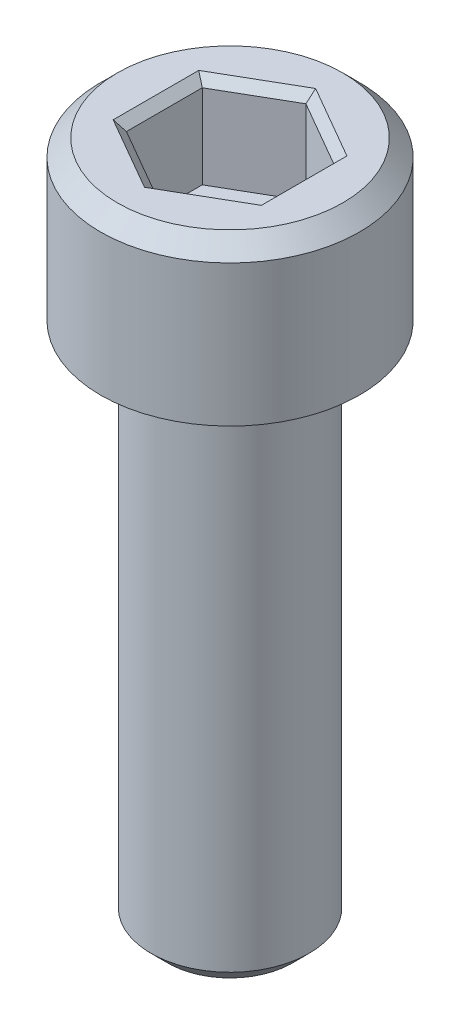
ISO-10303-21;
HEADER;
FILE_DESCRIPTION(('STEP AP214'),'2;1');
FILE_NAME('part.step','',(''),(''),'','','');
FILE_SCHEMA(('AUTOMOTIVE_DESIGN { 1 0 10303 214 1 1 1 1 }'));
ENDSEC;
DATA;
#1=APPLICATION_CONTEXT('core data for automotive mechanical design processes');
#2=APPLICATION_PROTOCOL_DEFINITION('international standard','automotive_design',2000,#1);
#3=PRODUCT_CONTEXT('',#1,'mechanical');
#4=PRODUCT('Part','Part','',(#3));
#5=PRODUCT_RELATED_PRODUCT_CATEGORY('part','',(#4));
#6=PRODUCT_DEFINITION_FORMATION('','',#4);
#7=PRODUCT_DEFINITION_CONTEXT('part definition',#1,'design');
#8=PRODUCT_DEFINITION('design','',#6,#7);
#9=PRODUCT_DEFINITION_SHAPE('','',#8);
#10=(LENGTH_UNIT() NAMED_UNIT(*) SI_UNIT(.MILLI.,.METRE.));
#11=(NAMED_UNIT(*) PLANE_ANGLE_UNIT() SI_UNIT($,.RADIAN.));
#12=(NAMED_UNIT(*) SI_UNIT($,.STERADIAN.) SOLID_ANGLE_UNIT());
#13=UNCERTAINTY_MEASURE_WITH_UNIT(LENGTH_MEASURE(1.E-05),#10,'distance_accuracy_value','');
#14=(GEOMETRIC_REPRESENTATION_CONTEXT(3) GLOBAL_UNCERTAINTY_ASSIGNED_CONTEXT((#13)) GLOBAL_UNIT_ASSIGNED_CONTEXT((#10,
#11,#12)) REPRESENTATION_CONTEXT('',''));
#15=CARTESIAN_POINT('',(0.,0.,0.));
#16=DIRECTION('',(0.,0.,1.));
#17=DIRECTION('',(1.,0.,0.));
#18=AXIS2_PLACEMENT_3D('',#15,#16,#17);
#19=CARTESIAN_POINT('',(0.,-4.77520000000009,0.));
#20=DIRECTION('',(0.,1.,0.));
#21=DIRECTION('',(0.,0.,1.));
#22=AXIS2_PLACEMENT_3D('',#19,#20,#21);
#23=CYLINDRICAL_SURFACE('',#22,3.9116);
#24=CARTESIAN_POINT('',(0.,-0.507999999965141,0.));
#25=DIRECTION('',(0.,1.,0.));
#26=DIRECTION('',(0.,0.,1.));
#27=AXIS2_PLACEMENT_3D('',#24,#25,#26);
#28=CIRCLE('',#27,3.9116);
#29=CARTESIAN_POINT('',(0.,-0.507999999965141,3.9116));
#30=VERTEX_POINT('',#29);
#31=EDGE_CURVE('E162',#30,#30,#28,.F.);
#32=ORIENTED_EDGE('',*,*,#31,.T.);
#33=EDGE_LOOP('',(#32));
#34=FACE_BOUND('',#33,.T.);
#35=CARTESIAN_POINT('',(0.,-4.77520000000009,0.));
#36=DIRECTION('',(0.,1.,0.));
#37=DIRECTION('',(0.,0.,1.));
#38=AXIS2_PLACEMENT_3D('',#35,#36,#37);
#39=CIRCLE('',#38,3.9116);
#40=CARTESIAN_POINT('',(0.,-4.77520000000009,3.9116));
#41=VERTEX_POINT('',#40);
#42=EDGE_CURVE('E138',#41,#41,#39,.T.);
#43=ORIENTED_EDGE('',*,*,#42,.T.);
#44=EDGE_LOOP('',(#43));
#45=FACE_BOUND('',#44,.T.);
#46=ADVANCED_FACE('F32',(#34,#45),#23,.T.);
#47=CARTESIAN_POINT('',(-3.9116,-4.77520000000009,0.));
#48=DIRECTION('',(0.,-1.,0.));
#49=DIRECTION('',(0.,0.,-1.));
#50=AXIS2_PLACEMENT_3D('',#47,#48,#49);
#51=PLANE('',#50);
#52=CARTESIAN_POINT('',(0.,-4.77520000000009,0.));
#53=DIRECTION('',(0.,-1.,0.));
#54=DIRECTION('',(0.,0.,-1.));
#55=AXIS2_PLACEMENT_3D('',#52,#53,#54);
#56=CIRCLE('',#55,2.3876);
#57=CARTESIAN_POINT('',(0.,-4.77520000000009,-2.3876));
#58=VERTEX_POINT('',#57);
#59=EDGE_CURVE('E148',#58,#58,#56,.T.);
#60=ORIENTED_EDGE('',*,*,#59,.F.);
#61=EDGE_LOOP('',(#60));
#62=FACE_BOUND('',#61,.T.);
#63=ORIENTED_EDGE('',*,*,#42,.F.);
#64=EDGE_LOOP('',(#63));
#65=FACE_BOUND('',#64,.T.);
#66=ADVANCED_FACE('F236',(#62,#65),#51,.T.);
#67=CARTESIAN_POINT('',(0.,0.,0.));
#68=DIRECTION('',(0.,1.,0.));
#69=DIRECTION('',(0.,0.,1.));
#70=AXIS2_PLACEMENT_3D('',#67,#68,#69);
#71=PLANE('',#70);
#72=DIRECTION('',(-0.866025403784438,0.,0.500000000000001));
#73=VECTOR('',#72,1.);
#74=CARTESIAN_POINT('',(0.126999999999997,0.,2.51132933256124));
#75=LINE('',#74,#73);
#76=CARTESIAN_POINT('',(2.23837499926705,0.,1.29232640837416));
#77=VERTEX_POINT('',#76);
#78=CARTESIAN_POINT('',(0.,0.,2.58465281674831));
#79=VERTEX_POINT('',#78);
#80=EDGE_CURVE('E176',#77,#79,#75,.T.);
#81=ORIENTED_EDGE('',*,*,#80,.T.);
#82=DIRECTION('',(-0.866025403784439,0.,-0.5));
#83=VECTOR('',#82,1.);
#84=CARTESIAN_POINT('',(-2.11137499926705,0.,1.36564989256124));
#85=LINE('',#84,#83);
#86=CARTESIAN_POINT('',(-2.23837499926705,0.,1.29232640837416));
#87=VERTEX_POINT('',#86);
#88=EDGE_CURVE('E178',#79,#87,#85,.T.);
#89=ORIENTED_EDGE('',*,*,#88,.T.);
#90=DIRECTION('',(0.,0.,-1.));
#91=VECTOR('',#90,1.);
#92=CARTESIAN_POINT('',(-2.23837499926705,0.,-1.14567944));
#93=LINE('',#92,#91);
#94=CARTESIAN_POINT('',(-2.23837499926705,0.,-1.29232640837416));
#95=VERTEX_POINT('',#94);
#96=EDGE_CURVE('E168',#87,#95,#93,.T.);
#97=ORIENTED_EDGE('',*,*,#96,.T.);
#98=DIRECTION('',(0.866025403784439,0.,-0.5));
#99=VECTOR('',#98,1.);
#100=CARTESIAN_POINT('',(-0.126999999999994,0.,-2.51132933256124));
#101=LINE('',#100,#99);
#102=CARTESIAN_POINT('',(0.,0.,-2.58465281674832));
#103=VERTEX_POINT('',#102);
#104=EDGE_CURVE('E170',#95,#103,#101,.T.);
#105=ORIENTED_EDGE('',*,*,#104,.T.);
#106=DIRECTION('',(0.866025403784439,0.,0.5));
#107=VECTOR('',#106,1.);
#108=CARTESIAN_POINT('',(2.11137499926705,0.,-1.36564989256124));
#109=LINE('',#108,#107);
#110=CARTESIAN_POINT('',(2.23837499926705,0.,-1.29232640837416));
#111=VERTEX_POINT('',#110);
#112=EDGE_CURVE('E172',#103,#111,#109,.T.);
#113=ORIENTED_EDGE('',*,*,#112,.T.);
#114=DIRECTION('',(0.,0.,1.));
#115=VECTOR('',#114,1.);
#116=CARTESIAN_POINT('',(2.23837499926705,0.,1.14567944));
#117=LINE('',#116,#115);
#118=EDGE_CURVE('E174',#111,#77,#117,.T.);
#119=ORIENTED_EDGE('',*,*,#118,.T.);
#120=EDGE_LOOP('',(#81,#89,#97,#105,#113,#119));
#121=FACE_BOUND('',#120,.T.);
#122=CARTESIAN_POINT('',(0.,0.,0.));
#123=DIRECTION('',(0.,1.,0.));
#124=DIRECTION('',(0.,0.,1.));
#125=AXIS2_PLACEMENT_3D('',#122,#123,#124);
#126=CIRCLE('',#125,3.40360000003486);
#127=CARTESIAN_POINT('',(0.,0.,3.40360000003486));
#128=VERTEX_POINT('',#127);
#129=EDGE_CURVE('E159',#128,#128,#126,.T.);
#130=ORIENTED_EDGE('',*,*,#129,.T.);
#131=EDGE_LOOP('',(#130));
#132=FACE_BOUND('',#131,.T.);
#133=ADVANCED_FACE('F242',(#121,#132),#71,.T.);
#134=CARTESIAN_POINT('',(0.,-20.6502,0.));
#135=DIRECTION('',(0.,1.,0.));
#136=DIRECTION('',(0.,0.,1.));
#137=AXIS2_PLACEMENT_3D('',#134,#135,#136);
#138=CYLINDRICAL_SURFACE('',#137,2.3876);
#139=CARTESIAN_POINT('',(0.,-20.1422000000348,0.));
#140=DIRECTION('',(0.,-1.,0.));
#141=DIRECTION('',(0.,0.,-1.));
#142=AXIS2_PLACEMENT_3D('',#139,#140,#141);
#143=CIRCLE('',#142,2.3876);
#144=CARTESIAN_POINT('',(0.,-20.1422000000348,-2.3876));
#145=VERTEX_POINT('',#144);
#146=EDGE_CURVE('E156',#145,#145,#143,.F.);
#147=ORIENTED_EDGE('',*,*,#146,.T.);
#148=EDGE_LOOP('',(#147));
#149=FACE_BOUND('',#148,.T.);
#150=ORIENTED_EDGE('',*,*,#59,.T.);
#151=EDGE_LOOP('',(#150));
#152=FACE_BOUND('',#151,.T.);
#153=ADVANCED_FACE('F330',(#149,#152),#138,.T.);
#154=CARTESIAN_POINT('',(0.,-20.6502,0.));
#155=DIRECTION('',(0.,-1.,0.));
#156=DIRECTION('',(0.,0.,-1.));
#157=AXIS2_PLACEMENT_3D('',#154,#155,#156);
#158=PLANE('',#157);
#159=CARTESIAN_POINT('',(0.,-20.6502,0.));
#160=DIRECTION('',(0.,-1.,0.));
#161=DIRECTION('',(0.,0.,-1.));
#162=AXIS2_PLACEMENT_3D('',#159,#160,#161);
#163=CIRCLE('',#162,1.87960000003485);
#164=CARTESIAN_POINT('',(0.,-20.6502,-1.87960000003485));
#165=VERTEX_POINT('',#164);
#166=EDGE_CURVE('E151',#165,#165,#163,.T.);
#167=ORIENTED_EDGE('',*,*,#166,.T.);
#168=EDGE_LOOP('',(#167));
#169=FACE_BOUND('',#168,.T.);
#170=ADVANCED_FACE('F232',(#169),#158,.T.);
#171=CARTESIAN_POINT('',(0.,-2.79399999999996,-2.29135888));
#172=DIRECTION('',(-0.5,0.,-0.866025403784439));
#173=DIRECTION('',(-0.866025403784439,0.,0.5));
#174=AXIS2_PLACEMENT_3D('',#171,#172,#173);
#175=PLANE('',#174);
#176=DIRECTION('',(0.,1.,0.));
#177=VECTOR('',#176,1.);
#178=CARTESIAN_POINT('',(0.,-2.79399999999996,-2.29135888));
#179=LINE('',#178,#177);
#180=CARTESIAN_POINT('',(0.,-2.79399999999996,-2.29135888));
#181=VERTEX_POINT('',#180);
#182=CARTESIAN_POINT('',(0.,-0.253999999999987,-2.29135888));
#183=VERTEX_POINT('',#182);
#184=EDGE_CURVE('E136',#181,#183,#179,.T.);
#185=ORIENTED_EDGE('',*,*,#184,.T.);
#186=DIRECTION('',(-0.866025403784439,0.,0.5));
#187=VECTOR('',#186,1.);
#188=CARTESIAN_POINT('',(-1.98437499926706,-0.253999999999987,-1.14567944));
#189=LINE('',#188,#187);
#190=CARTESIAN_POINT('',(-1.98437499926706,-0.253999999999987,-1.14567944));
#191=VERTEX_POINT('',#190);
#192=EDGE_CURVE('E41',#183,#191,#189,.T.);
#193=ORIENTED_EDGE('',*,*,#192,.T.);
#194=DIRECTION('',(0.,1.,0.));
#195=VECTOR('',#194,1.);
#196=CARTESIAN_POINT('',(-1.98437499926706,-2.79399999999996,-1.14567944));
#197=LINE('',#196,#195);
#198=CARTESIAN_POINT('',(-1.98437499926706,-2.79399999999996,-1.14567944));
#199=VERTEX_POINT('',#198);
#200=EDGE_CURVE('E102',#199,#191,#197,.T.);
#201=ORIENTED_EDGE('',*,*,#200,.F.);
#202=DIRECTION('',(-0.866025403784439,0.,0.5));
#203=VECTOR('',#202,1.);
#204=CARTESIAN_POINT('',(0.,-2.79399999999996,-2.29135888));
#205=LINE('',#204,#203);
#206=EDGE_CURVE('E106',#181,#199,#205,.T.);
#207=ORIENTED_EDGE('',*,*,#206,.F.);
#208=EDGE_LOOP('',(#185,#193,#201,#207));
#209=FACE_BOUND('',#208,.T.);
#210=ADVANCED_FACE('F104',(#209),#175,.F.);
#211=CARTESIAN_POINT('',(1.98437499926706,-2.79399999999996,-1.14567944));
#212=DIRECTION('',(0.5,0.,-0.866025403784439));
#213=DIRECTION('',(-0.866025403784439,0.,-0.5));
#214=AXIS2_PLACEMENT_3D('',#211,#212,#213);
#215=PLANE('',#214);
#216=DIRECTION('',(0.,1.,0.));
#217=VECTOR('',#216,1.);
#218=CARTESIAN_POINT('',(1.98437499926706,-2.79399999999996,-1.14567944));
#219=LINE('',#218,#217);
#220=CARTESIAN_POINT('',(1.98437499926706,-2.79399999999996,-1.14567944));
#221=VERTEX_POINT('',#220);
#222=CARTESIAN_POINT('',(1.98437499926706,-0.253999999999987,-1.14567944));
#223=VERTEX_POINT('',#222);
#224=EDGE_CURVE('E139',#221,#223,#219,.T.);
#225=ORIENTED_EDGE('',*,*,#224,.T.);
#226=DIRECTION('',(-0.866025403784439,0.,-0.5));
#227=VECTOR('',#226,1.);
#228=CARTESIAN_POINT('',(0.,-0.253999999999987,-2.29135888));
#229=LINE('',#228,#227);
#230=EDGE_CURVE('E56',#223,#183,#229,.T.);
#231=ORIENTED_EDGE('',*,*,#230,.T.);
#232=ORIENTED_EDGE('',*,*,#184,.F.);
#233=DIRECTION('',(-0.866025403784439,0.,-0.5));
#234=VECTOR('',#233,1.);
#235=CARTESIAN_POINT('',(1.98437499926706,-2.79399999999996,-1.14567944));
#236=LINE('',#235,#234);
#237=EDGE_CURVE('E111',#221,#181,#236,.T.);
#238=ORIENTED_EDGE('',*,*,#237,.F.);
#239=EDGE_LOOP('',(#225,#231,#232,#238));
#240=FACE_BOUND('',#239,.T.);
#241=ADVANCED_FACE('F224',(#240),#215,.F.);
#242=CARTESIAN_POINT('',(1.98437499926706,-2.79399999999996,1.14567944));
#243=DIRECTION('',(1.,0.,0.));
#244=DIRECTION('',(0.,0.,-1.));
#245=AXIS2_PLACEMENT_3D('',#242,#243,#244);
#246=PLANE('',#245);
#247=DIRECTION('',(0.,1.,0.));
#248=VECTOR('',#247,1.);
#249=CARTESIAN_POINT('',(1.98437499926706,-2.79399999999996,1.14567944));
#250=LINE('',#249,#248);
#251=CARTESIAN_POINT('',(1.98437499926706,-2.79399999999996,1.14567944));
#252=VERTEX_POINT('',#251);
#253=CARTESIAN_POINT('',(1.98437499926706,-0.253999999999987,1.14567944));
#254=VERTEX_POINT('',#253);
#255=EDGE_CURVE('E141',#252,#254,#250,.T.);
#256=ORIENTED_EDGE('',*,*,#255,.T.);
#257=DIRECTION('',(0.,0.,-1.));
#258=VECTOR('',#257,1.);
#259=CARTESIAN_POINT('',(1.98437499926706,-0.253999999999987,-1.14567944));
#260=LINE('',#259,#258);
#261=EDGE_CURVE('E183',#254,#223,#260,.T.);
#262=ORIENTED_EDGE('',*,*,#261,.T.);
#263=ORIENTED_EDGE('',*,*,#224,.F.);
#264=DIRECTION('',(0.,0.,-1.));
#265=VECTOR('',#264,1.);
#266=CARTESIAN_POINT('',(1.98437499926706,-2.79399999999996,1.14567944));
#267=LINE('',#266,#265);
#268=EDGE_CURVE('E133',#252,#221,#267,.T.);
#269=ORIENTED_EDGE('',*,*,#268,.F.);
#270=EDGE_LOOP('',(#256,#262,#263,#269));
#271=FACE_BOUND('',#270,.T.);
#272=ADVANCED_FACE('F223',(#271),#246,.F.);
#273=CARTESIAN_POINT('',(0.,-2.79399999999996,2.29135888));
#274=DIRECTION('',(0.500000000000001,0.,0.866025403784438));
#275=DIRECTION('',(0.866025403784438,0.,-0.500000000000001));
#276=AXIS2_PLACEMENT_3D('',#273,#274,#275);
#277=PLANE('',#276);
#278=DIRECTION('',(0.,1.,0.));
#279=VECTOR('',#278,1.);
#280=CARTESIAN_POINT('',(0.,-2.79399999999996,2.29135888));
#281=LINE('',#280,#279);
#282=CARTESIAN_POINT('',(0.,-2.79399999999996,2.29135888));
#283=VERTEX_POINT('',#282);
#284=CARTESIAN_POINT('',(0.,-0.253999999999987,2.29135888));
#285=VERTEX_POINT('',#284);
#286=EDGE_CURVE('E144',#283,#285,#281,.T.);
#287=ORIENTED_EDGE('',*,*,#286,.T.);
#288=DIRECTION('',(0.866025403784438,0.,-0.500000000000001));
#289=VECTOR('',#288,1.);
#290=CARTESIAN_POINT('',(1.98437499926706,-0.253999999999987,1.14567944));
#291=LINE('',#290,#289);
#292=EDGE_CURVE('E181',#285,#254,#291,.T.);
#293=ORIENTED_EDGE('',*,*,#292,.T.);
#294=ORIENTED_EDGE('',*,*,#255,.F.);
#295=DIRECTION('',(0.866025403784438,0.,-0.500000000000001));
#296=VECTOR('',#295,1.);
#297=CARTESIAN_POINT('',(0.,-2.79399999999996,2.29135888));
#298=LINE('',#297,#296);
#299=EDGE_CURVE('E130',#283,#252,#298,.T.);
#300=ORIENTED_EDGE('',*,*,#299,.F.);
#301=EDGE_LOOP('',(#287,#293,#294,#300));
#302=FACE_BOUND('',#301,.T.);
#303=ADVANCED_FACE('F220',(#302),#277,.F.);
#304=CARTESIAN_POINT('',(-1.98437499926706,-2.79399999999996,1.14567944));
#305=DIRECTION('',(-0.5,0.,0.866025403784439));
#306=DIRECTION('',(0.866025403784439,0.,0.5));
#307=AXIS2_PLACEMENT_3D('',#304,#305,#306);
#308=PLANE('',#307);
#309=DIRECTION('',(0.,1.,0.));
#310=VECTOR('',#309,1.);
#311=CARTESIAN_POINT('',(-1.98437499926706,-2.79399999999996,1.14567944));
#312=LINE('',#311,#310);
#313=CARTESIAN_POINT('',(-1.98437499926706,-2.79399999999996,1.14567944));
#314=VERTEX_POINT('',#313);
#315=CARTESIAN_POINT('',(-1.98437499926706,-0.253999999999987,1.14567944));
#316=VERTEX_POINT('',#315);
#317=EDGE_CURVE('E110',#314,#316,#312,.T.);
#318=ORIENTED_EDGE('',*,*,#317,.T.);
#319=DIRECTION('',(0.866025403784439,0.,0.5));
#320=VECTOR('',#319,1.);
#321=CARTESIAN_POINT('',(0.,-0.253999999999987,2.29135888));
#322=LINE('',#321,#320);
#323=EDGE_CURVE('E165',#316,#285,#322,.T.);
#324=ORIENTED_EDGE('',*,*,#323,.T.);
#325=ORIENTED_EDGE('',*,*,#286,.F.);
#326=DIRECTION('',(0.866025403784439,0.,0.5));
#327=VECTOR('',#326,1.);
#328=CARTESIAN_POINT('',(-1.98437499926706,-2.79399999999996,1.14567944));
#329=LINE('',#328,#327);
#330=EDGE_CURVE('E120',#314,#283,#329,.T.);
#331=ORIENTED_EDGE('',*,*,#330,.F.);
#332=EDGE_LOOP('',(#318,#324,#325,#331));
#333=FACE_BOUND('',#332,.T.);
#334=ADVANCED_FACE('F216',(#333),#308,.F.);
#335=CARTESIAN_POINT('',(-1.98437499926706,-2.79399999999996,-1.14567944));
#336=DIRECTION('',(-1.,0.,0.));
#337=DIRECTION('',(0.,0.,1.));
#338=AXIS2_PLACEMENT_3D('',#335,#336,#337);
#339=PLANE('',#338);
#340=ORIENTED_EDGE('',*,*,#200,.T.);
#341=DIRECTION('',(0.,0.,1.));
#342=VECTOR('',#341,1.);
#343=CARTESIAN_POINT('',(-1.98437499926706,-0.253999999999987,1.14567944));
#344=LINE('',#343,#342);
#345=EDGE_CURVE('E11',#191,#316,#344,.T.);
#346=ORIENTED_EDGE('',*,*,#345,.T.);
#347=ORIENTED_EDGE('',*,*,#317,.F.);
#348=DIRECTION('',(0.,0.,1.));
#349=VECTOR('',#348,1.);
#350=CARTESIAN_POINT('',(-1.98437499926706,-2.79399999999996,-1.14567944));
#351=LINE('',#350,#349);
#352=EDGE_CURVE('E114',#199,#314,#351,.T.);
#353=ORIENTED_EDGE('',*,*,#352,.F.);
#354=EDGE_LOOP('',(#340,#346,#347,#353));
#355=FACE_BOUND('',#354,.T.);
#356=ADVANCED_FACE('F115',(#355),#339,.F.);
#357=CARTESIAN_POINT('',(0.,-2.79399999999996,0.));
#358=DIRECTION('',(0.,1.,0.));
#359=DIRECTION('',(0.,0.,1.));
#360=AXIS2_PLACEMENT_3D('',#357,#358,#359);
#361=PLANE('',#360);
#362=ORIENTED_EDGE('',*,*,#206,.T.);
#363=ORIENTED_EDGE('',*,*,#352,.T.);
#364=ORIENTED_EDGE('',*,*,#330,.T.);
#365=ORIENTED_EDGE('',*,*,#299,.T.);
#366=ORIENTED_EDGE('',*,*,#268,.T.);
#367=ORIENTED_EDGE('',*,*,#237,.T.);
#368=EDGE_LOOP('',(#362,#363,#364,#365,#366,#367));
#369=FACE_BOUND('',#368,.T.);
#370=ADVANCED_FACE('F122',(#369),#361,.T.);
#371=CARTESIAN_POINT('',(0.,-20.6502,0.));
#372=DIRECTION('',(0.,1.,0.));
#373=DIRECTION('',(0.,0.,1.));
#374=AXIS2_PLACEMENT_3D('',#371,#372,#373);
#375=CONICAL_SURFACE('',#374,1.87960000003485,0.785398163397448);
#376=ORIENTED_EDGE('',*,*,#146,.F.);
#377=EDGE_LOOP('',(#376));
#378=FACE_BOUND('',#377,.T.);
#379=ORIENTED_EDGE('',*,*,#166,.F.);
#380=EDGE_LOOP('',(#379));
#381=FACE_BOUND('',#380,.T.);
#382=ADVANCED_FACE('F248',(#378,#381),#375,.T.);
#383=CARTESIAN_POINT('',(0.,0.,0.));
#384=DIRECTION('',(0.,-1.,0.));
#385=DIRECTION('',(0.,0.,-1.));
#386=AXIS2_PLACEMENT_3D('',#383,#384,#385);
#387=CONICAL_SURFACE('',#386,3.40360000003486,0.785398163397446);
#388=ORIENTED_EDGE('',*,*,#31,.F.);
#389=EDGE_LOOP('',(#388));
#390=FACE_BOUND('',#389,.T.);
#391=ORIENTED_EDGE('',*,*,#129,.F.);
#392=EDGE_LOOP('',(#391));
#393=FACE_BOUND('',#392,.T.);
#394=ADVANCED_FACE('F251',(#390,#393),#387,.T.);
#395=CARTESIAN_POINT('',(1.98437499926706,-0.253999999999987,-1.14567944));
#396=DIRECTION('',(-0.353553390593274,0.707106781186547,0.612372435695795));
#397=DIRECTION('',(0.866025403784439,0.,0.5));
#398=AXIS2_PLACEMENT_3D('',#395,#396,#397);
#399=PLANE('',#398);
#400=DIRECTION('',(0.654653670707976,0.654653670707978,-0.377964473009228));
#401=VECTOR('',#400,1.);
#402=CARTESIAN_POINT('',(1.41741071376219,-0.820964285504863,-0.818342457142855));
#403=LINE('',#402,#401);
#404=EDGE_CURVE('E127',#111,#223,#403,.F.);
#405=ORIENTED_EDGE('',*,*,#404,.F.);
#406=ORIENTED_EDGE('',*,*,#112,.F.);
#407=DIRECTION('',(0.,0.654653670707977,-0.755928946018455));
#408=VECTOR('',#407,1.);
#409=CARTESIAN_POINT('',(0.,-0.820964285504863,-1.63668491428571));
#410=LINE('',#409,#408);
#411=EDGE_CURVE('E36',#183,#103,#410,.T.);
#412=ORIENTED_EDGE('',*,*,#411,.F.);
#413=ORIENTED_EDGE('',*,*,#230,.F.);
#414=EDGE_LOOP('',(#405,#406,#412,#413));
#415=FACE_BOUND('',#414,.T.);
#416=ADVANCED_FACE('F34',(#415),#399,.T.);
#417=CARTESIAN_POINT('',(0.,-0.253999999999987,-2.29135888));
#418=DIRECTION('',(0.353553390593273,0.707106781186548,0.612372435695794));
#419=DIRECTION('',(0.866025403784439,0.,-0.5));
#420=AXIS2_PLACEMENT_3D('',#417,#418,#419);
#421=PLANE('',#420);
#422=ORIENTED_EDGE('',*,*,#411,.T.);
#423=ORIENTED_EDGE('',*,*,#104,.F.);
#424=DIRECTION('',(-0.654653670707977,0.654653670707977,-0.377964473009229));
#425=VECTOR('',#424,1.);
#426=CARTESIAN_POINT('',(-1.41741071376219,-0.820964285504859,-0.818342457142857));
#427=LINE('',#426,#425);
#428=EDGE_CURVE('E194',#191,#95,#427,.T.);
#429=ORIENTED_EDGE('',*,*,#428,.F.);
#430=ORIENTED_EDGE('',*,*,#192,.F.);
#431=EDGE_LOOP('',(#422,#423,#429,#430));
#432=FACE_BOUND('',#431,.T.);
#433=ADVANCED_FACE('F208',(#432),#421,.T.);
#434=CARTESIAN_POINT('',(1.98437499926706,-0.253999999999987,1.14567944));
#435=DIRECTION('',(-0.707106781186548,0.707106781186547,0.));
#436=DIRECTION('',(0.,0.,1.));
#437=AXIS2_PLACEMENT_3D('',#434,#435,#436);
#438=PLANE('',#437);
#439=ORIENTED_EDGE('',*,*,#404,.T.);
#440=ORIENTED_EDGE('',*,*,#261,.F.);
#441=DIRECTION('',(0.654653670707976,0.654653670707978,0.377964473009229));
#442=VECTOR('',#441,1.);
#443=CARTESIAN_POINT('',(1.41741071376219,-0.820964285504857,0.818342457142858));
#444=LINE('',#443,#442);
#445=EDGE_CURVE('E191',#77,#254,#444,.F.);
#446=ORIENTED_EDGE('',*,*,#445,.F.);
#447=ORIENTED_EDGE('',*,*,#118,.F.);
#448=EDGE_LOOP('',(#439,#440,#446,#447));
#449=FACE_BOUND('',#448,.T.);
#450=ADVANCED_FACE('F201',(#449),#438,.T.);
#451=CARTESIAN_POINT('',(-1.98437499926706,-0.253999999999987,-1.14567944));
#452=DIRECTION('',(0.707106781186548,0.707106781186548,0.));
#453=DIRECTION('',(0.,0.,-1.));
#454=AXIS2_PLACEMENT_3D('',#451,#452,#453);
#455=PLANE('',#454);
#456=ORIENTED_EDGE('',*,*,#428,.T.);
#457=ORIENTED_EDGE('',*,*,#96,.F.);
#458=DIRECTION('',(0.654653670707977,-0.654653670707977,-0.377964473009228));
#459=VECTOR('',#458,1.);
#460=CARTESIAN_POINT('',(-1.98437499926706,-0.253999999999987,1.14567944));
#461=LINE('',#460,#459);
#462=EDGE_CURVE('E189',#316,#87,#461,.F.);
#463=ORIENTED_EDGE('',*,*,#462,.F.);
#464=ORIENTED_EDGE('',*,*,#345,.F.);
#465=EDGE_LOOP('',(#456,#457,#463,#464));
#466=FACE_BOUND('',#465,.T.);
#467=ADVANCED_FACE('F213',(#466),#455,.T.);
#468=CARTESIAN_POINT('',(0.,-0.253999999999987,2.29135888));
#469=DIRECTION('',(-0.353553390593274,0.707106781186548,-0.612372435695794));
#470=DIRECTION('',(-0.866025403784438,0.,0.500000000000001));
#471=AXIS2_PLACEMENT_3D('',#468,#469,#470);
#472=PLANE('',#471);
#473=ORIENTED_EDGE('',*,*,#445,.T.);
#474=ORIENTED_EDGE('',*,*,#292,.F.);
#475=DIRECTION('',(0.,0.654653670707977,0.755928946018455));
#476=VECTOR('',#475,1.);
#477=CARTESIAN_POINT('',(0.,-0.820964285504861,1.63668491428571));
#478=LINE('',#477,#476);
#479=EDGE_CURVE('E187',#79,#285,#478,.F.);
#480=ORIENTED_EDGE('',*,*,#479,.F.);
#481=ORIENTED_EDGE('',*,*,#80,.F.);
#482=EDGE_LOOP('',(#473,#474,#480,#481));
#483=FACE_BOUND('',#482,.T.);
#484=ADVANCED_FACE('F259',(#483),#472,.T.);
#485=CARTESIAN_POINT('',(-1.98437499926706,-0.253999999999987,1.14567944));
#486=DIRECTION('',(0.353553390593273,0.707106781186548,-0.612372435695795));
#487=DIRECTION('',(-0.866025403784439,0.,-0.5));
#488=AXIS2_PLACEMENT_3D('',#485,#486,#487);
#489=PLANE('',#488);
#490=ORIENTED_EDGE('',*,*,#462,.T.);
#491=ORIENTED_EDGE('',*,*,#88,.F.);
#492=ORIENTED_EDGE('',*,*,#479,.T.);
#493=ORIENTED_EDGE('',*,*,#323,.F.);
#494=EDGE_LOOP('',(#490,#491,#492,#493));
#495=FACE_BOUND('',#494,.T.);
#496=ADVANCED_FACE('F256',(#495),#489,.T.);
#497=CLOSED_SHELL('',(#46,#66,#133,#153,#170,#210,#241,#272,#303,#334,#356,#370,#382,#394,#416,
#433,#450,#467,#484,#496));
#498=MANIFOLD_SOLID_BREP('B2',#497);
#499=ADVANCED_BREP_SHAPE_REPRESENTATION('',(#18,#498),#14);
#500=SHAPE_DEFINITION_REPRESENTATION(#9,#499);
ENDSEC;
END-ISO-10303-21;
